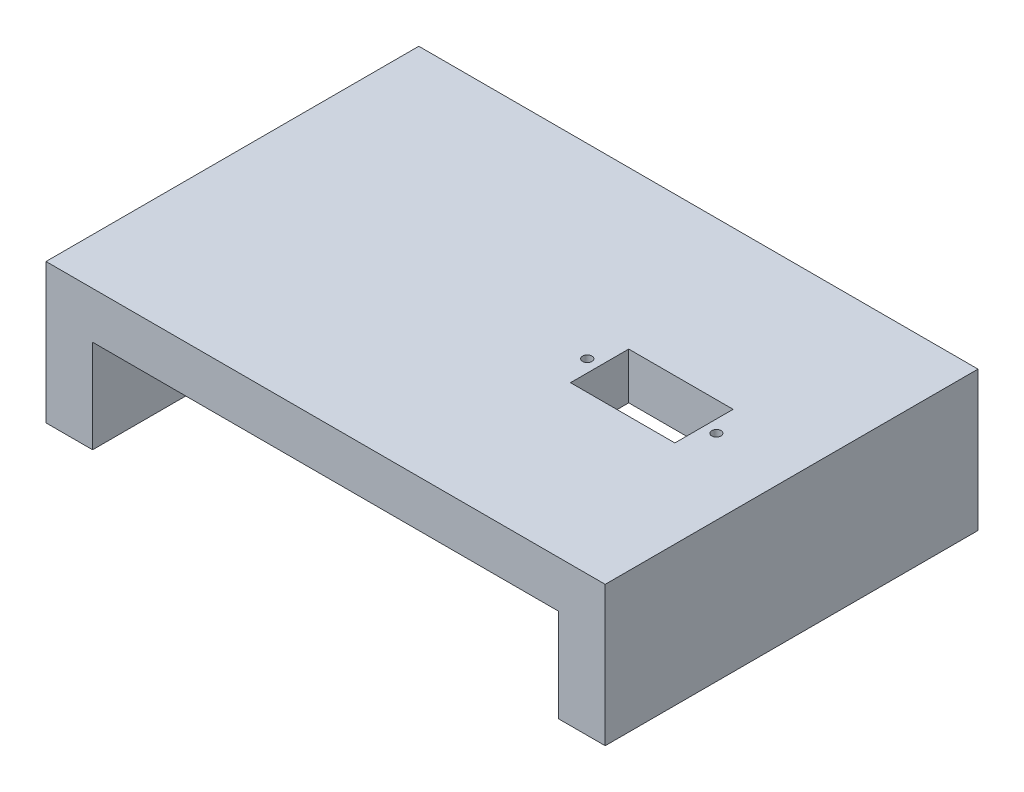
ISO-10303-21;
HEADER;
FILE_DESCRIPTION(('STEP AP214'),'2;1');
FILE_NAME('part.step','',(''),(''),'','','');
FILE_SCHEMA(('AUTOMOTIVE_DESIGN { 1 0 10303 214 1 1 1 1 }'));
ENDSEC;
DATA;
#1=APPLICATION_CONTEXT('core data for automotive mechanical design processes');
#2=APPLICATION_PROTOCOL_DEFINITION('international standard','automotive_design',2000,#1);
#3=PRODUCT_CONTEXT('',#1,'mechanical');
#4=PRODUCT('Part','Part','',(#3));
#5=PRODUCT_RELATED_PRODUCT_CATEGORY('part','',(#4));
#6=PRODUCT_DEFINITION_FORMATION('','',#4);
#7=PRODUCT_DEFINITION_CONTEXT('part definition',#1,'design');
#8=PRODUCT_DEFINITION('design','',#6,#7);
#9=PRODUCT_DEFINITION_SHAPE('','',#8);
#10=(LENGTH_UNIT() NAMED_UNIT(*) SI_UNIT(.MILLI.,.METRE.));
#11=(NAMED_UNIT(*) PLANE_ANGLE_UNIT() SI_UNIT($,.RADIAN.));
#12=(NAMED_UNIT(*) SI_UNIT($,.STERADIAN.) SOLID_ANGLE_UNIT());
#13=UNCERTAINTY_MEASURE_WITH_UNIT(LENGTH_MEASURE(1.E-05),#10,'distance_accuracy_value','');
#14=(GEOMETRIC_REPRESENTATION_CONTEXT(3) GLOBAL_UNCERTAINTY_ASSIGNED_CONTEXT((#13)) GLOBAL_UNIT_ASSIGNED_CONTEXT((#10,
#11,#12)) REPRESENTATION_CONTEXT('',''));
#15=CARTESIAN_POINT('',(0.,0.,0.));
#16=DIRECTION('',(0.,0.,1.));
#17=DIRECTION('',(1.,0.,0.));
#18=AXIS2_PLACEMENT_3D('',#15,#16,#17);
#19=CARTESIAN_POINT('',(60.,10.,40.));
#20=DIRECTION('',(-1.,0.,0.));
#21=DIRECTION('',(0.,0.,1.));
#22=AXIS2_PLACEMENT_3D('',#19,#20,#21);
#23=PLANE('',#22);
#24=DIRECTION('',(0.,-1.,0.));
#25=VECTOR('',#24,1.);
#26=CARTESIAN_POINT('',(60.,10.,40.));
#27=LINE('',#26,#25);
#28=CARTESIAN_POINT('',(60.,10.,40.));
#29=VERTEX_POINT('',#28);
#30=CARTESIAN_POINT('',(60.,-20.,40.));
#31=VERTEX_POINT('',#30);
#32=EDGE_CURVE('E259',#29,#31,#27,.T.);
#33=ORIENTED_EDGE('',*,*,#32,.T.);
#34=DIRECTION('',(0.,0.,1.));
#35=VECTOR('',#34,1.);
#36=CARTESIAN_POINT('',(60.,-20.,40.));
#37=LINE('',#36,#35);
#38=CARTESIAN_POINT('',(60.,-20.,-40.));
#39=VERTEX_POINT('',#38);
#40=EDGE_CURVE('E189',#39,#31,#37,.T.);
#41=ORIENTED_EDGE('',*,*,#40,.F.);
#42=DIRECTION('',(0.,-1.,0.));
#43=VECTOR('',#42,1.);
#44=CARTESIAN_POINT('',(60.,10.,-40.));
#45=LINE('',#44,#43);
#46=CARTESIAN_POINT('',(60.,10.,-40.));
#47=VERTEX_POINT('',#46);
#48=EDGE_CURVE('E11',#47,#39,#45,.T.);
#49=ORIENTED_EDGE('',*,*,#48,.F.);
#50=DIRECTION('',(0.,0.,-1.));
#51=VECTOR('',#50,1.);
#52=CARTESIAN_POINT('',(60.,10.,40.));
#53=LINE('',#52,#51);
#54=EDGE_CURVE('E246',#29,#47,#53,.T.);
#55=ORIENTED_EDGE('',*,*,#54,.F.);
#56=EDGE_LOOP('',(#33,#41,#49,#55));
#57=FACE_BOUND('',#56,.T.);
#58=ADVANCED_FACE('F45',(#57),#23,.F.);
#59=CARTESIAN_POINT('',(-60.,10.,-40.));
#60=DIRECTION('',(0.,0.,1.));
#61=DIRECTION('',(1.,0.,0.));
#62=AXIS2_PLACEMENT_3D('',#59,#60,#61);
#63=PLANE('',#62);
#64=ORIENTED_EDGE('',*,*,#48,.T.);
#65=DIRECTION('',(1.,0.,0.));
#66=VECTOR('',#65,1.);
#67=CARTESIAN_POINT('',(60.,-20.,-40.));
#68=LINE('',#67,#66);
#69=CARTESIAN_POINT('',(50.,-20.,-40.));
#70=VERTEX_POINT('',#69);
#71=EDGE_CURVE('E186',#70,#39,#68,.T.);
#72=ORIENTED_EDGE('',*,*,#71,.F.);
#73=DIRECTION('',(0.,1.,0.));
#74=VECTOR('',#73,1.);
#75=CARTESIAN_POINT('',(50.,-20.,-40.));
#76=LINE('',#75,#74);
#77=CARTESIAN_POINT('',(50.,0.,-40.));
#78=VERTEX_POINT('',#77);
#79=EDGE_CURVE('E182',#70,#78,#76,.T.);
#80=ORIENTED_EDGE('',*,*,#79,.T.);
#81=DIRECTION('',(-1.,0.,0.));
#82=VECTOR('',#81,1.);
#83=CARTESIAN_POINT('',(-60.,0.,-40.));
#84=LINE('',#83,#82);
#85=CARTESIAN_POINT('',(-50.,0.,-40.));
#86=VERTEX_POINT('',#85);
#87=EDGE_CURVE('E236',#78,#86,#84,.T.);
#88=ORIENTED_EDGE('',*,*,#87,.T.);
#89=DIRECTION('',(0.,1.,0.));
#90=VECTOR('',#89,1.);
#91=CARTESIAN_POINT('',(-50.,-20.,-40.));
#92=LINE('',#91,#90);
#93=CARTESIAN_POINT('',(-50.,-20.,-40.));
#94=VERTEX_POINT('',#93);
#95=EDGE_CURVE('E149',#94,#86,#92,.T.);
#96=ORIENTED_EDGE('',*,*,#95,.F.);
#97=DIRECTION('',(1.,0.,0.));
#98=VECTOR('',#97,1.);
#99=CARTESIAN_POINT('',(-60.,-20.,-40.));
#100=LINE('',#99,#98);
#101=CARTESIAN_POINT('',(-60.,-20.,-40.));
#102=VERTEX_POINT('',#101);
#103=EDGE_CURVE('E146',#102,#94,#100,.T.);
#104=ORIENTED_EDGE('',*,*,#103,.F.);
#105=DIRECTION('',(0.,-1.,0.));
#106=VECTOR('',#105,1.);
#107=CARTESIAN_POINT('',(-60.,10.,-40.));
#108=LINE('',#107,#106);
#109=CARTESIAN_POINT('',(-60.,10.,-40.));
#110=VERTEX_POINT('',#109);
#111=EDGE_CURVE('E54',#110,#102,#108,.T.);
#112=ORIENTED_EDGE('',*,*,#111,.F.);
#113=DIRECTION('',(-1.,0.,0.));
#114=VECTOR('',#113,1.);
#115=CARTESIAN_POINT('',(-60.,10.,-40.));
#116=LINE('',#115,#114);
#117=EDGE_CURVE('E250',#47,#110,#116,.T.);
#118=ORIENTED_EDGE('',*,*,#117,.F.);
#119=EDGE_LOOP('',(#64,#72,#80,#88,#96,#104,#112,#118));
#120=FACE_BOUND('',#119,.T.);
#121=ADVANCED_FACE('F147',(#120),#63,.F.);
#122=CARTESIAN_POINT('',(-60.,10.,40.));
#123=DIRECTION('',(1.,0.,0.));
#124=DIRECTION('',(0.,0.,-1.));
#125=AXIS2_PLACEMENT_3D('',#122,#123,#124);
#126=PLANE('',#125);
#127=ORIENTED_EDGE('',*,*,#111,.T.);
#128=DIRECTION('',(0.,0.,-1.));
#129=VECTOR('',#128,1.);
#130=CARTESIAN_POINT('',(-60.,-20.,40.));
#131=LINE('',#130,#129);
#132=CARTESIAN_POINT('',(-60.,-20.,40.));
#133=VERTEX_POINT('',#132);
#134=EDGE_CURVE('E139',#133,#102,#131,.T.);
#135=ORIENTED_EDGE('',*,*,#134,.F.);
#136=DIRECTION('',(0.,-1.,0.));
#137=VECTOR('',#136,1.);
#138=CARTESIAN_POINT('',(-60.,10.,40.));
#139=LINE('',#138,#137);
#140=CARTESIAN_POINT('',(-60.,10.,40.));
#141=VERTEX_POINT('',#140);
#142=EDGE_CURVE('E143',#141,#133,#139,.T.);
#143=ORIENTED_EDGE('',*,*,#142,.F.);
#144=DIRECTION('',(0.,0.,1.));
#145=VECTOR('',#144,1.);
#146=CARTESIAN_POINT('',(-60.,10.,40.));
#147=LINE('',#146,#145);
#148=EDGE_CURVE('E140',#110,#141,#147,.T.);
#149=ORIENTED_EDGE('',*,*,#148,.F.);
#150=EDGE_LOOP('',(#127,#135,#143,#149));
#151=FACE_BOUND('',#150,.T.);
#152=ADVANCED_FACE('F136',(#151),#126,.F.);
#153=CARTESIAN_POINT('',(-60.,10.,40.));
#154=DIRECTION('',(0.,0.,-1.));
#155=DIRECTION('',(-1.,0.,0.));
#156=AXIS2_PLACEMENT_3D('',#153,#154,#155);
#157=PLANE('',#156);
#158=ORIENTED_EDGE('',*,*,#142,.T.);
#159=DIRECTION('',(-1.,0.,0.));
#160=VECTOR('',#159,1.);
#161=CARTESIAN_POINT('',(-60.,-20.,40.));
#162=LINE('',#161,#160);
#163=CARTESIAN_POINT('',(-50.,-20.,40.));
#164=VERTEX_POINT('',#163);
#165=EDGE_CURVE('E158',#164,#133,#162,.T.);
#166=ORIENTED_EDGE('',*,*,#165,.F.);
#167=DIRECTION('',(0.,1.,0.));
#168=VECTOR('',#167,1.);
#169=CARTESIAN_POINT('',(-50.,-20.,40.));
#170=LINE('',#169,#168);
#171=CARTESIAN_POINT('',(-50.,0.,40.));
#172=VERTEX_POINT('',#171);
#173=EDGE_CURVE('E170',#164,#172,#170,.T.);
#174=ORIENTED_EDGE('',*,*,#173,.T.);
#175=DIRECTION('',(1.,0.,0.));
#176=VECTOR('',#175,1.);
#177=CARTESIAN_POINT('',(-60.,0.,40.));
#178=LINE('',#177,#176);
#179=CARTESIAN_POINT('',(50.,0.,40.));
#180=VERTEX_POINT('',#179);
#181=EDGE_CURVE('E251',#172,#180,#178,.T.);
#182=ORIENTED_EDGE('',*,*,#181,.T.);
#183=DIRECTION('',(0.,1.,0.));
#184=VECTOR('',#183,1.);
#185=CARTESIAN_POINT('',(50.,-20.,40.));
#186=LINE('',#185,#184);
#187=CARTESIAN_POINT('',(50.,-20.,40.));
#188=VERTEX_POINT('',#187);
#189=EDGE_CURVE('E178',#188,#180,#186,.T.);
#190=ORIENTED_EDGE('',*,*,#189,.F.);
#191=DIRECTION('',(-1.,0.,0.));
#192=VECTOR('',#191,1.);
#193=CARTESIAN_POINT('',(60.,-20.,40.));
#194=LINE('',#193,#192);
#195=EDGE_CURVE('E196',#31,#188,#194,.T.);
#196=ORIENTED_EDGE('',*,*,#195,.F.);
#197=ORIENTED_EDGE('',*,*,#32,.F.);
#198=DIRECTION('',(1.,0.,0.));
#199=VECTOR('',#198,1.);
#200=CARTESIAN_POINT('',(-60.,10.,40.));
#201=LINE('',#200,#199);
#202=EDGE_CURVE('E256',#141,#29,#201,.T.);
#203=ORIENTED_EDGE('',*,*,#202,.F.);
#204=EDGE_LOOP('',(#158,#166,#174,#182,#190,#196,#197,#203));
#205=FACE_BOUND('',#204,.T.);
#206=ADVANCED_FACE('F289',(#205),#157,.F.);
#207=CARTESIAN_POINT('',(0.,10.,0.));
#208=DIRECTION('',(0.,-1.,0.));
#209=DIRECTION('',(0.,0.,-1.));
#210=AXIS2_PLACEMENT_3D('',#207,#208,#209);
#211=PLANE('',#210);
#212=CARTESIAN_POINT('',(16.15,10.,0.));
#213=DIRECTION('',(0.,1.,0.));
#214=DIRECTION('',(0.,0.,1.));
#215=AXIS2_PLACEMENT_3D('',#212,#213,#214);
#216=CIRCLE('',#215,1.);
#217=CARTESIAN_POINT('',(16.15,10.,1.));
#218=VERTEX_POINT('',#217);
#219=EDGE_CURVE('E270',#218,#218,#216,.T.);
#220=ORIENTED_EDGE('',*,*,#219,.F.);
#221=EDGE_LOOP('',(#220));
#222=FACE_BOUND('',#221,.T.);
#223=CARTESIAN_POINT('',(43.85,10.,0.));
#224=DIRECTION('',(0.,1.,0.));
#225=DIRECTION('',(0.,0.,1.));
#226=AXIS2_PLACEMENT_3D('',#223,#224,#225);
#227=CIRCLE('',#226,0.999999999999998);
#228=CARTESIAN_POINT('',(43.85,10.,0.999999999999995));
#229=VERTEX_POINT('',#228);
#230=EDGE_CURVE('E164',#229,#229,#227,.T.);
#231=ORIENTED_EDGE('',*,*,#230,.F.);
#232=EDGE_LOOP('',(#231));
#233=FACE_BOUND('',#232,.T.);
#234=DIRECTION('',(-1.,0.,0.));
#235=VECTOR('',#234,1.);
#236=CARTESIAN_POINT('',(18.8,10.,-6.25));
#237=LINE('',#236,#235);
#238=CARTESIAN_POINT('',(41.2,10.,-6.25));
#239=VERTEX_POINT('',#238);
#240=CARTESIAN_POINT('',(18.8,10.,-6.25));
#241=VERTEX_POINT('',#240);
#242=EDGE_CURVE('E222',#239,#241,#237,.T.);
#243=ORIENTED_EDGE('',*,*,#242,.F.);
#244=DIRECTION('',(0.,0.,-1.));
#245=VECTOR('',#244,1.);
#246=CARTESIAN_POINT('',(41.2,10.,6.25));
#247=LINE('',#246,#245);
#248=CARTESIAN_POINT('',(41.2,10.,6.25));
#249=VERTEX_POINT('',#248);
#250=EDGE_CURVE('E177',#249,#239,#247,.T.);
#251=ORIENTED_EDGE('',*,*,#250,.F.);
#252=DIRECTION('',(1.,0.,0.));
#253=VECTOR('',#252,1.);
#254=CARTESIAN_POINT('',(18.8,10.,6.25));
#255=LINE('',#254,#253);
#256=CARTESIAN_POINT('',(18.8,10.,6.25));
#257=VERTEX_POINT('',#256);
#258=EDGE_CURVE('E207',#257,#249,#255,.T.);
#259=ORIENTED_EDGE('',*,*,#258,.F.);
#260=DIRECTION('',(0.,0.,1.));
#261=VECTOR('',#260,1.);
#262=CARTESIAN_POINT('',(18.8,10.,6.25));
#263=LINE('',#262,#261);
#264=EDGE_CURVE('E226',#241,#257,#263,.T.);
#265=ORIENTED_EDGE('',*,*,#264,.F.);
#266=EDGE_LOOP('',(#243,#251,#259,#265));
#267=FACE_BOUND('',#266,.T.);
#268=ORIENTED_EDGE('',*,*,#54,.T.);
#269=ORIENTED_EDGE('',*,*,#117,.T.);
#270=ORIENTED_EDGE('',*,*,#148,.T.);
#271=ORIENTED_EDGE('',*,*,#202,.T.);
#272=EDGE_LOOP('',(#268,#269,#270,#271));
#273=FACE_BOUND('',#272,.T.);
#274=ADVANCED_FACE('F285',(#222,#233,#267,#273),#211,.F.);
#275=CARTESIAN_POINT('',(0.,0.,0.));
#276=DIRECTION('',(0.,-1.,0.));
#277=DIRECTION('',(0.,0.,-1.));
#278=AXIS2_PLACEMENT_3D('',#275,#276,#277);
#279=PLANE('',#278);
#280=CARTESIAN_POINT('',(16.15,0.,0.));
#281=DIRECTION('',(0.,-1.,0.));
#282=DIRECTION('',(0.,0.,-1.));
#283=AXIS2_PLACEMENT_3D('',#280,#281,#282);
#284=CIRCLE('',#283,1.);
#285=CARTESIAN_POINT('',(16.15,0.,-1.));
#286=VERTEX_POINT('',#285);
#287=EDGE_CURVE('E48',#286,#286,#284,.T.);
#288=ORIENTED_EDGE('',*,*,#287,.F.);
#289=EDGE_LOOP('',(#288));
#290=FACE_BOUND('',#289,.T.);
#291=CARTESIAN_POINT('',(43.85,0.,0.));
#292=DIRECTION('',(0.,-1.,0.));
#293=DIRECTION('',(0.,0.,-1.));
#294=AXIS2_PLACEMENT_3D('',#291,#292,#293);
#295=CIRCLE('',#294,0.999999999999998);
#296=CARTESIAN_POINT('',(43.85,0.,-1.));
#297=VERTEX_POINT('',#296);
#298=EDGE_CURVE('E267',#297,#297,#295,.T.);
#299=ORIENTED_EDGE('',*,*,#298,.F.);
#300=EDGE_LOOP('',(#299));
#301=FACE_BOUND('',#300,.T.);
#302=DIRECTION('',(0.,0.,1.));
#303=VECTOR('',#302,1.);
#304=CARTESIAN_POINT('',(-50.,0.,40.));
#305=LINE('',#304,#303);
#306=EDGE_CURVE('E62',#86,#172,#305,.T.);
#307=ORIENTED_EDGE('',*,*,#306,.F.);
#308=ORIENTED_EDGE('',*,*,#87,.F.);
#309=DIRECTION('',(0.,0.,-1.));
#310=VECTOR('',#309,1.);
#311=CARTESIAN_POINT('',(50.,0.,40.));
#312=LINE('',#311,#310);
#313=EDGE_CURVE('E67',#180,#78,#312,.T.);
#314=ORIENTED_EDGE('',*,*,#313,.F.);
#315=ORIENTED_EDGE('',*,*,#181,.F.);
#316=EDGE_LOOP('',(#307,#308,#314,#315));
#317=FACE_BOUND('',#316,.T.);
#318=DIRECTION('',(0.,0.,-1.));
#319=VECTOR('',#318,1.);
#320=CARTESIAN_POINT('',(41.2,0.,6.25));
#321=LINE('',#320,#319);
#322=CARTESIAN_POINT('',(41.2,0.,6.25));
#323=VERTEX_POINT('',#322);
#324=CARTESIAN_POINT('',(41.2,0.,-6.25));
#325=VERTEX_POINT('',#324);
#326=EDGE_CURVE('E202',#323,#325,#321,.T.);
#327=ORIENTED_EDGE('',*,*,#326,.T.);
#328=DIRECTION('',(-1.,0.,0.));
#329=VECTOR('',#328,1.);
#330=CARTESIAN_POINT('',(18.8,0.,-6.25));
#331=LINE('',#330,#329);
#332=CARTESIAN_POINT('',(18.8,0.,-6.25));
#333=VERTEX_POINT('',#332);
#334=EDGE_CURVE('E206',#325,#333,#331,.T.);
#335=ORIENTED_EDGE('',*,*,#334,.T.);
#336=DIRECTION('',(0.,0.,1.));
#337=VECTOR('',#336,1.);
#338=CARTESIAN_POINT('',(18.8,0.,6.25));
#339=LINE('',#338,#337);
#340=CARTESIAN_POINT('',(18.8,0.,6.25));
#341=VERTEX_POINT('',#340);
#342=EDGE_CURVE('E211',#333,#341,#339,.T.);
#343=ORIENTED_EDGE('',*,*,#342,.T.);
#344=DIRECTION('',(1.,0.,0.));
#345=VECTOR('',#344,1.);
#346=CARTESIAN_POINT('',(18.8,0.,6.25));
#347=LINE('',#346,#345);
#348=EDGE_CURVE('E215',#341,#323,#347,.T.);
#349=ORIENTED_EDGE('',*,*,#348,.T.);
#350=EDGE_LOOP('',(#327,#335,#343,#349));
#351=FACE_BOUND('',#350,.T.);
#352=ADVANCED_FACE('F288',(#290,#301,#317,#351),#279,.T.);
#353=CARTESIAN_POINT('',(41.2,0.,6.25));
#354=DIRECTION('',(1.,0.,0.));
#355=DIRECTION('',(0.,0.,-1.));
#356=AXIS2_PLACEMENT_3D('',#353,#354,#355);
#357=PLANE('',#356);
#358=ORIENTED_EDGE('',*,*,#250,.T.);
#359=DIRECTION('',(0.,1.,0.));
#360=VECTOR('',#359,1.);
#361=CARTESIAN_POINT('',(41.2,0.,-6.25));
#362=LINE('',#361,#360);
#363=EDGE_CURVE('E219',#325,#239,#362,.T.);
#364=ORIENTED_EDGE('',*,*,#363,.F.);
#365=ORIENTED_EDGE('',*,*,#326,.F.);
#366=DIRECTION('',(0.,1.,0.));
#367=VECTOR('',#366,1.);
#368=CARTESIAN_POINT('',(41.2,0.,6.25));
#369=LINE('',#368,#367);
#370=EDGE_CURVE('E233',#323,#249,#369,.T.);
#371=ORIENTED_EDGE('',*,*,#370,.T.);
#372=EDGE_LOOP('',(#358,#364,#365,#371));
#373=FACE_BOUND('',#372,.T.);
#374=ADVANCED_FACE('F317',(#373),#357,.F.);
#375=CARTESIAN_POINT('',(18.8,0.,6.25));
#376=DIRECTION('',(0.,0.,1.));
#377=DIRECTION('',(1.,0.,0.));
#378=AXIS2_PLACEMENT_3D('',#375,#376,#377);
#379=PLANE('',#378);
#380=ORIENTED_EDGE('',*,*,#258,.T.);
#381=ORIENTED_EDGE('',*,*,#370,.F.);
#382=ORIENTED_EDGE('',*,*,#348,.F.);
#383=DIRECTION('',(0.,1.,0.));
#384=VECTOR('',#383,1.);
#385=CARTESIAN_POINT('',(18.8,0.,6.25));
#386=LINE('',#385,#384);
#387=EDGE_CURVE('E237',#341,#257,#386,.T.);
#388=ORIENTED_EDGE('',*,*,#387,.T.);
#389=EDGE_LOOP('',(#380,#381,#382,#388));
#390=FACE_BOUND('',#389,.T.);
#391=ADVANCED_FACE('F331',(#390),#379,.F.);
#392=CARTESIAN_POINT('',(18.8,0.,6.25));
#393=DIRECTION('',(-1.,0.,0.));
#394=DIRECTION('',(0.,0.,1.));
#395=AXIS2_PLACEMENT_3D('',#392,#393,#394);
#396=PLANE('',#395);
#397=ORIENTED_EDGE('',*,*,#264,.T.);
#398=ORIENTED_EDGE('',*,*,#387,.F.);
#399=ORIENTED_EDGE('',*,*,#342,.F.);
#400=DIRECTION('',(0.,1.,0.));
#401=VECTOR('',#400,1.);
#402=CARTESIAN_POINT('',(18.8,0.,-6.25));
#403=LINE('',#402,#401);
#404=EDGE_CURVE('E240',#333,#241,#403,.T.);
#405=ORIENTED_EDGE('',*,*,#404,.T.);
#406=EDGE_LOOP('',(#397,#398,#399,#405));
#407=FACE_BOUND('',#406,.T.);
#408=ADVANCED_FACE('F328',(#407),#396,.F.);
#409=CARTESIAN_POINT('',(18.8,0.,-6.25));
#410=DIRECTION('',(0.,0.,-1.));
#411=DIRECTION('',(-1.,0.,0.));
#412=AXIS2_PLACEMENT_3D('',#409,#410,#411);
#413=PLANE('',#412);
#414=ORIENTED_EDGE('',*,*,#242,.T.);
#415=ORIENTED_EDGE('',*,*,#404,.F.);
#416=ORIENTED_EDGE('',*,*,#334,.F.);
#417=ORIENTED_EDGE('',*,*,#363,.T.);
#418=EDGE_LOOP('',(#414,#415,#416,#417));
#419=FACE_BOUND('',#418,.T.);
#420=ADVANCED_FACE('F326',(#419),#413,.F.);
#421=CARTESIAN_POINT('',(50.,-20.,40.));
#422=DIRECTION('',(1.,0.,0.));
#423=DIRECTION('',(0.,0.,-1.));
#424=AXIS2_PLACEMENT_3D('',#421,#422,#423);
#425=PLANE('',#424);
#426=ORIENTED_EDGE('',*,*,#313,.T.);
#427=ORIENTED_EDGE('',*,*,#79,.F.);
#428=DIRECTION('',(0.,0.,-1.));
#429=VECTOR('',#428,1.);
#430=CARTESIAN_POINT('',(50.,-20.,40.));
#431=LINE('',#430,#429);
#432=EDGE_CURVE('E193',#188,#70,#431,.T.);
#433=ORIENTED_EDGE('',*,*,#432,.F.);
#434=ORIENTED_EDGE('',*,*,#189,.T.);
#435=EDGE_LOOP('',(#426,#427,#433,#434));
#436=FACE_BOUND('',#435,.T.);
#437=ADVANCED_FACE('F310',(#436),#425,.F.);
#438=CARTESIAN_POINT('',(0.,-20.,0.));
#439=DIRECTION('',(0.,1.,0.));
#440=DIRECTION('',(0.,0.,1.));
#441=AXIS2_PLACEMENT_3D('',#438,#439,#440);
#442=PLANE('',#441);
#443=ORIENTED_EDGE('',*,*,#40,.T.);
#444=ORIENTED_EDGE('',*,*,#195,.T.);
#445=ORIENTED_EDGE('',*,*,#432,.T.);
#446=ORIENTED_EDGE('',*,*,#71,.T.);
#447=EDGE_LOOP('',(#443,#444,#445,#446));
#448=FACE_BOUND('',#447,.T.);
#449=ADVANCED_FACE('F304',(#448),#442,.F.);
#450=CARTESIAN_POINT('',(-50.,-20.,40.));
#451=DIRECTION('',(-1.,0.,0.));
#452=DIRECTION('',(0.,0.,1.));
#453=AXIS2_PLACEMENT_3D('',#450,#451,#452);
#454=PLANE('',#453);
#455=ORIENTED_EDGE('',*,*,#306,.T.);
#456=ORIENTED_EDGE('',*,*,#173,.F.);
#457=DIRECTION('',(0.,0.,1.));
#458=VECTOR('',#457,1.);
#459=CARTESIAN_POINT('',(-50.,-20.,40.));
#460=LINE('',#459,#458);
#461=EDGE_CURVE('E153',#94,#164,#460,.T.);
#462=ORIENTED_EDGE('',*,*,#461,.F.);
#463=ORIENTED_EDGE('',*,*,#95,.T.);
#464=EDGE_LOOP('',(#455,#456,#462,#463));
#465=FACE_BOUND('',#464,.T.);
#466=ADVANCED_FACE('F312',(#465),#454,.F.);
#467=CARTESIAN_POINT('',(0.,-20.,0.));
#468=DIRECTION('',(0.,-1.,0.));
#469=DIRECTION('',(0.,0.,-1.));
#470=AXIS2_PLACEMENT_3D('',#467,#468,#469);
#471=PLANE('',#470);
#472=ORIENTED_EDGE('',*,*,#134,.T.);
#473=ORIENTED_EDGE('',*,*,#103,.T.);
#474=ORIENTED_EDGE('',*,*,#461,.T.);
#475=ORIENTED_EDGE('',*,*,#165,.T.);
#476=EDGE_LOOP('',(#472,#473,#474,#475));
#477=FACE_BOUND('',#476,.T.);
#478=ADVANCED_FACE('F156',(#477),#471,.T.);
#479=CARTESIAN_POINT('',(43.85,-2.,0.));
#480=DIRECTION('',(0.,1.,0.));
#481=DIRECTION('',(0.,0.,1.));
#482=AXIS2_PLACEMENT_3D('',#479,#480,#481);
#483=CYLINDRICAL_SURFACE('',#482,0.999999999999998);
#484=ORIENTED_EDGE('',*,*,#298,.T.);
#485=EDGE_LOOP('',(#484));
#486=FACE_BOUND('',#485,.T.);
#487=ORIENTED_EDGE('',*,*,#230,.T.);
#488=EDGE_LOOP('',(#487));
#489=FACE_BOUND('',#488,.T.);
#490=ADVANCED_FACE('F283',(#486,#489),#483,.F.);
#491=CARTESIAN_POINT('',(16.15,-2.,0.));
#492=DIRECTION('',(0.,1.,0.));
#493=DIRECTION('',(0.,0.,1.));
#494=AXIS2_PLACEMENT_3D('',#491,#492,#493);
#495=CYLINDRICAL_SURFACE('',#494,1.);
#496=ORIENTED_EDGE('',*,*,#287,.T.);
#497=EDGE_LOOP('',(#496));
#498=FACE_BOUND('',#497,.T.);
#499=ORIENTED_EDGE('',*,*,#219,.T.);
#500=EDGE_LOOP('',(#499));
#501=FACE_BOUND('',#500,.T.);
#502=ADVANCED_FACE('F367',(#498,#501),#495,.F.);
#503=CLOSED_SHELL('',(#58,#121,#152,#206,#274,#352,#374,#391,#408,#420,#437,#449,#466,#478,#490,#502));
#504=MANIFOLD_SOLID_BREP('B2',#503);
#505=ADVANCED_BREP_SHAPE_REPRESENTATION('',(#18,#504),#14);
#506=SHAPE_DEFINITION_REPRESENTATION(#9,#505);
ENDSEC;
END-ISO-10303-21;
